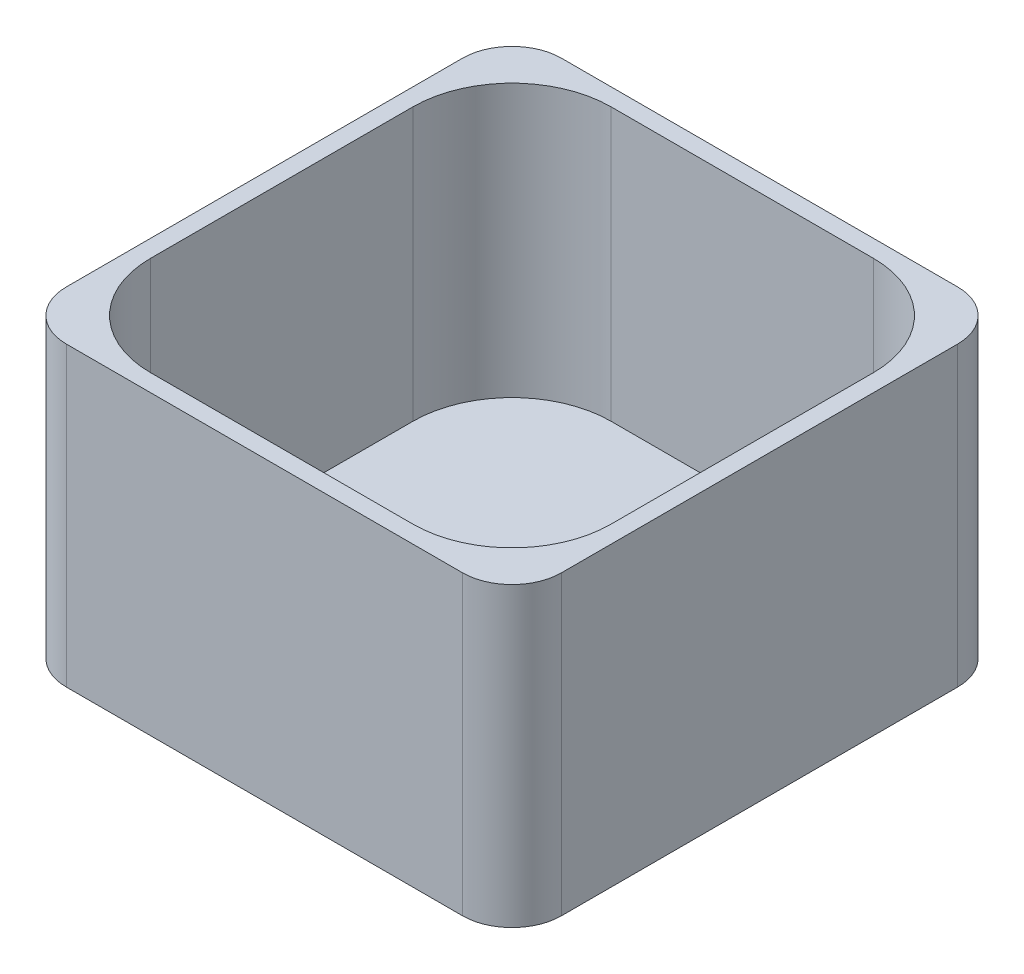
ISO-10303-21;
HEADER;
FILE_DESCRIPTION(('STEP AP214'),'2;1');
FILE_NAME('part.step','',(''),(''),'','','');
FILE_SCHEMA(('AUTOMOTIVE_DESIGN { 1 0 10303 214 1 1 1 1 }'));
ENDSEC;
DATA;
#1=APPLICATION_CONTEXT('core data for automotive mechanical design processes');
#2=APPLICATION_PROTOCOL_DEFINITION('international standard','automotive_design',2000,#1);
#3=PRODUCT_CONTEXT('',#1,'mechanical');
#4=PRODUCT('Part','Part','',(#3));
#5=PRODUCT_RELATED_PRODUCT_CATEGORY('part','',(#4));
#6=PRODUCT_DEFINITION_FORMATION('','',#4);
#7=PRODUCT_DEFINITION_CONTEXT('part definition',#1,'design');
#8=PRODUCT_DEFINITION('design','',#6,#7);
#9=PRODUCT_DEFINITION_SHAPE('','',#8);
#10=(LENGTH_UNIT() NAMED_UNIT(*) SI_UNIT(.MILLI.,.METRE.));
#11=(NAMED_UNIT(*) PLANE_ANGLE_UNIT() SI_UNIT($,.RADIAN.));
#12=(NAMED_UNIT(*) SI_UNIT($,.STERADIAN.) SOLID_ANGLE_UNIT());
#13=UNCERTAINTY_MEASURE_WITH_UNIT(LENGTH_MEASURE(1.E-05),#10,'distance_accuracy_value','');
#14=(GEOMETRIC_REPRESENTATION_CONTEXT(3) GLOBAL_UNCERTAINTY_ASSIGNED_CONTEXT((#13)) GLOBAL_UNIT_ASSIGNED_CONTEXT((#10,
#11,#12)) REPRESENTATION_CONTEXT('',''));
#15=CARTESIAN_POINT('',(0.,0.,0.));
#16=DIRECTION('',(0.,0.,1.));
#17=DIRECTION('',(1.,0.,0.));
#18=AXIS2_PLACEMENT_3D('',#15,#16,#17);
#19=CARTESIAN_POINT('',(50.,60.,50.));
#20=DIRECTION('',(-1.,0.,0.));
#21=DIRECTION('',(0.,0.,1.));
#22=AXIS2_PLACEMENT_3D('',#19,#20,#21);
#23=PLANE('',#22);
#24=DIRECTION('',(0.,0.,-1.));
#25=VECTOR('',#24,1.);
#26=CARTESIAN_POINT('',(50.,0.,50.));
#27=LINE('',#26,#25);
#28=CARTESIAN_POINT('',(50.,0.,40.));
#29=VERTEX_POINT('',#28);
#30=CARTESIAN_POINT('',(50.,0.,-40.));
#31=VERTEX_POINT('',#30);
#32=EDGE_CURVE('E208',#29,#31,#27,.T.);
#33=ORIENTED_EDGE('',*,*,#32,.T.);
#34=DIRECTION('',(0.,-1.,0.));
#35=VECTOR('',#34,1.);
#36=CARTESIAN_POINT('',(50.,60.,-40.));
#37=LINE('',#36,#35);
#38=CARTESIAN_POINT('',(50.,60.,-40.));
#39=VERTEX_POINT('',#38);
#40=EDGE_CURVE('E262',#31,#39,#37,.F.);
#41=ORIENTED_EDGE('',*,*,#40,.T.);
#42=DIRECTION('',(0.,0.,-1.));
#43=VECTOR('',#42,1.);
#44=CARTESIAN_POINT('',(50.,60.,50.));
#45=LINE('',#44,#43);
#46=CARTESIAN_POINT('',(50.,60.,40.));
#47=VERTEX_POINT('',#46);
#48=EDGE_CURVE('E197',#47,#39,#45,.T.);
#49=ORIENTED_EDGE('',*,*,#48,.F.);
#50=DIRECTION('',(0.,-1.,0.));
#51=VECTOR('',#50,1.);
#52=CARTESIAN_POINT('',(50.,60.,40.));
#53=LINE('',#52,#51);
#54=EDGE_CURVE('E261',#47,#29,#53,.T.);
#55=ORIENTED_EDGE('',*,*,#54,.T.);
#56=EDGE_LOOP('',(#33,#41,#49,#55));
#57=FACE_BOUND('',#56,.T.);
#58=ADVANCED_FACE('F44',(#57),#23,.F.);
#59=CARTESIAN_POINT('',(-50.,60.,-50.));
#60=DIRECTION('',(0.,0.,1.));
#61=DIRECTION('',(1.,0.,0.));
#62=AXIS2_PLACEMENT_3D('',#59,#60,#61);
#63=PLANE('',#62);
#64=DIRECTION('',(-1.,0.,0.));
#65=VECTOR('',#64,1.);
#66=CARTESIAN_POINT('',(-50.,60.,-50.));
#67=LINE('',#66,#65);
#68=CARTESIAN_POINT('',(40.,60.,-50.));
#69=VERTEX_POINT('',#68);
#70=CARTESIAN_POINT('',(-40.,60.,-50.));
#71=VERTEX_POINT('',#70);
#72=EDGE_CURVE('E199',#69,#71,#67,.T.);
#73=ORIENTED_EDGE('',*,*,#72,.F.);
#74=DIRECTION('',(0.,-1.,0.));
#75=VECTOR('',#74,1.);
#76=CARTESIAN_POINT('',(40.,60.,-50.));
#77=LINE('',#76,#75);
#78=CARTESIAN_POINT('',(40.,0.,-50.));
#79=VERTEX_POINT('',#78);
#80=EDGE_CURVE('E246',#69,#79,#77,.T.);
#81=ORIENTED_EDGE('',*,*,#80,.T.);
#82=DIRECTION('',(-1.,0.,0.));
#83=VECTOR('',#82,1.);
#84=CARTESIAN_POINT('',(-50.,0.,-50.));
#85=LINE('',#84,#83);
#86=CARTESIAN_POINT('',(-40.,0.,-50.));
#87=VERTEX_POINT('',#86);
#88=EDGE_CURVE('E211',#79,#87,#85,.T.);
#89=ORIENTED_EDGE('',*,*,#88,.T.);
#90=DIRECTION('',(0.,-1.,0.));
#91=VECTOR('',#90,1.);
#92=CARTESIAN_POINT('',(-40.,60.,-50.));
#93=LINE('',#92,#91);
#94=EDGE_CURVE('E248',#87,#71,#93,.F.);
#95=ORIENTED_EDGE('',*,*,#94,.T.);
#96=EDGE_LOOP('',(#73,#81,#89,#95));
#97=FACE_BOUND('',#96,.T.);
#98=ADVANCED_FACE('F308',(#97),#63,.F.);
#99=CARTESIAN_POINT('',(-50.,60.,50.));
#100=DIRECTION('',(1.,0.,0.));
#101=DIRECTION('',(0.,0.,-1.));
#102=AXIS2_PLACEMENT_3D('',#99,#100,#101);
#103=PLANE('',#102);
#104=DIRECTION('',(0.,0.,1.));
#105=VECTOR('',#104,1.);
#106=CARTESIAN_POINT('',(-50.,60.,50.));
#107=LINE('',#106,#105);
#108=CARTESIAN_POINT('',(-50.,60.,-40.));
#109=VERTEX_POINT('',#108);
#110=CARTESIAN_POINT('',(-50.,60.,40.));
#111=VERTEX_POINT('',#110);
#112=EDGE_CURVE('E204',#109,#111,#107,.T.);
#113=ORIENTED_EDGE('',*,*,#112,.F.);
#114=DIRECTION('',(0.,-1.,0.));
#115=VECTOR('',#114,1.);
#116=CARTESIAN_POINT('',(-50.,60.,-40.));
#117=LINE('',#116,#115);
#118=CARTESIAN_POINT('',(-50.,0.,-40.));
#119=VERTEX_POINT('',#118);
#120=EDGE_CURVE('E274',#109,#119,#117,.T.);
#121=ORIENTED_EDGE('',*,*,#120,.T.);
#122=DIRECTION('',(0.,0.,1.));
#123=VECTOR('',#122,1.);
#124=CARTESIAN_POINT('',(-50.,0.,50.));
#125=LINE('',#124,#123);
#126=CARTESIAN_POINT('',(-50.,0.,40.));
#127=VERTEX_POINT('',#126);
#128=EDGE_CURVE('E212',#119,#127,#125,.T.);
#129=ORIENTED_EDGE('',*,*,#128,.T.);
#130=DIRECTION('',(0.,-1.,0.));
#131=VECTOR('',#130,1.);
#132=CARTESIAN_POINT('',(-50.,60.,40.));
#133=LINE('',#132,#131);
#134=EDGE_CURVE('E272',#127,#111,#133,.F.);
#135=ORIENTED_EDGE('',*,*,#134,.T.);
#136=EDGE_LOOP('',(#113,#121,#129,#135));
#137=FACE_BOUND('',#136,.T.);
#138=ADVANCED_FACE('F283',(#137),#103,.F.);
#139=CARTESIAN_POINT('',(-50.,60.,50.));
#140=DIRECTION('',(0.,0.,-1.));
#141=DIRECTION('',(-1.,0.,0.));
#142=AXIS2_PLACEMENT_3D('',#139,#140,#141);
#143=PLANE('',#142);
#144=DIRECTION('',(1.,0.,0.));
#145=VECTOR('',#144,1.);
#146=CARTESIAN_POINT('',(-50.,60.,50.));
#147=LINE('',#146,#145);
#148=CARTESIAN_POINT('',(-40.,60.,50.));
#149=VERTEX_POINT('',#148);
#150=CARTESIAN_POINT('',(40.,60.,50.));
#151=VERTEX_POINT('',#150);
#152=EDGE_CURVE('E206',#149,#151,#147,.T.);
#153=ORIENTED_EDGE('',*,*,#152,.F.);
#154=DIRECTION('',(0.,-1.,0.));
#155=VECTOR('',#154,1.);
#156=CARTESIAN_POINT('',(-40.,60.,50.));
#157=LINE('',#156,#155);
#158=CARTESIAN_POINT('',(-40.,0.,50.));
#159=VERTEX_POINT('',#158);
#160=EDGE_CURVE('E11',#149,#159,#157,.T.);
#161=ORIENTED_EDGE('',*,*,#160,.T.);
#162=DIRECTION('',(1.,0.,0.));
#163=VECTOR('',#162,1.);
#164=CARTESIAN_POINT('',(-50.,0.,50.));
#165=LINE('',#164,#163);
#166=CARTESIAN_POINT('',(40.,0.,50.));
#167=VERTEX_POINT('',#166);
#168=EDGE_CURVE('E203',#159,#167,#165,.T.);
#169=ORIENTED_EDGE('',*,*,#168,.T.);
#170=DIRECTION('',(0.,-1.,0.));
#171=VECTOR('',#170,1.);
#172=CARTESIAN_POINT('',(40.,60.,50.));
#173=LINE('',#172,#171);
#174=EDGE_CURVE('E52',#167,#151,#173,.F.);
#175=ORIENTED_EDGE('',*,*,#174,.T.);
#176=EDGE_LOOP('',(#153,#161,#169,#175));
#177=FACE_BOUND('',#176,.T.);
#178=ADVANCED_FACE('F295',(#177),#143,.F.);
#179=CARTESIAN_POINT('',(0.,60.,0.));
#180=DIRECTION('',(0.,-1.,0.));
#181=DIRECTION('',(0.,0.,-1.));
#182=AXIS2_PLACEMENT_3D('',#179,#180,#181);
#183=PLANE('',#182);
#184=DIRECTION('',(-1.,0.,0.));
#185=VECTOR('',#184,1.);
#186=CARTESIAN_POINT('',(-46.5,60.,-46.5));
#187=LINE('',#186,#185);
#188=CARTESIAN_POINT('',(26.5,60.,-46.5));
#189=VERTEX_POINT('',#188);
#190=CARTESIAN_POINT('',(-26.5,60.,-46.5));
#191=VERTEX_POINT('',#190);
#192=EDGE_CURVE('E193',#189,#191,#187,.T.);
#193=ORIENTED_EDGE('',*,*,#192,.F.);
#194=CARTESIAN_POINT('',(26.5,60.,-26.5));
#195=DIRECTION('',(0.,-1.,0.));
#196=DIRECTION('',(0.,0.,-1.));
#197=AXIS2_PLACEMENT_3D('',#194,#195,#196);
#198=CIRCLE('',#197,20.);
#199=CARTESIAN_POINT('',(46.5,60.,-26.5));
#200=VERTEX_POINT('',#199);
#201=EDGE_CURVE('E241',#189,#200,#198,.T.);
#202=ORIENTED_EDGE('',*,*,#201,.T.);
#203=DIRECTION('',(0.,0.,-1.));
#204=VECTOR('',#203,1.);
#205=CARTESIAN_POINT('',(46.5,60.,46.5));
#206=LINE('',#205,#204);
#207=CARTESIAN_POINT('',(46.5,60.,26.5));
#208=VERTEX_POINT('',#207);
#209=EDGE_CURVE('E222',#208,#200,#206,.T.);
#210=ORIENTED_EDGE('',*,*,#209,.F.);
#211=CARTESIAN_POINT('',(26.5,60.,26.5));
#212=DIRECTION('',(0.,-1.,0.));
#213=DIRECTION('',(0.,0.,-1.));
#214=AXIS2_PLACEMENT_3D('',#211,#212,#213);
#215=CIRCLE('',#214,20.);
#216=CARTESIAN_POINT('',(26.5,60.,46.5));
#217=VERTEX_POINT('',#216);
#218=EDGE_CURVE('E188',#208,#217,#215,.T.);
#219=ORIENTED_EDGE('',*,*,#218,.T.);
#220=DIRECTION('',(1.,0.,0.));
#221=VECTOR('',#220,1.);
#222=CARTESIAN_POINT('',(-46.5,60.,46.5));
#223=LINE('',#222,#221);
#224=CARTESIAN_POINT('',(-26.5,60.,46.5));
#225=VERTEX_POINT('',#224);
#226=EDGE_CURVE('E177',#225,#217,#223,.T.);
#227=ORIENTED_EDGE('',*,*,#226,.F.);
#228=CARTESIAN_POINT('',(-26.5,60.,26.5));
#229=DIRECTION('',(0.,-1.,0.));
#230=DIRECTION('',(0.,0.,-1.));
#231=AXIS2_PLACEMENT_3D('',#228,#229,#230);
#232=CIRCLE('',#231,20.);
#233=CARTESIAN_POINT('',(-46.5,60.,26.5));
#234=VERTEX_POINT('',#233);
#235=EDGE_CURVE('E157',#225,#234,#232,.T.);
#236=ORIENTED_EDGE('',*,*,#235,.T.);
#237=DIRECTION('',(0.,0.,1.));
#238=VECTOR('',#237,1.);
#239=CARTESIAN_POINT('',(-46.5,60.,46.5));
#240=LINE('',#239,#238);
#241=CARTESIAN_POINT('',(-46.5,60.,-26.5));
#242=VERTEX_POINT('',#241);
#243=EDGE_CURVE('E187',#242,#234,#240,.T.);
#244=ORIENTED_EDGE('',*,*,#243,.F.);
#245=CARTESIAN_POINT('',(-26.5,60.,-26.5));
#246=DIRECTION('',(0.,-1.,0.));
#247=DIRECTION('',(0.,0.,-1.));
#248=AXIS2_PLACEMENT_3D('',#245,#246,#247);
#249=CIRCLE('',#248,20.);
#250=EDGE_CURVE('E166',#242,#191,#249,.T.);
#251=ORIENTED_EDGE('',*,*,#250,.T.);
#252=EDGE_LOOP('',(#193,#202,#210,#219,#227,#236,#244,#251));
#253=FACE_BOUND('',#252,.T.);
#254=ORIENTED_EDGE('',*,*,#48,.T.);
#255=CARTESIAN_POINT('',(40.,60.,-40.));
#256=DIRECTION('',(0.,-1.,0.));
#257=DIRECTION('',(0.,0.,-1.));
#258=AXIS2_PLACEMENT_3D('',#255,#256,#257);
#259=CIRCLE('',#258,10.);
#260=EDGE_CURVE('E271',#39,#69,#259,.F.);
#261=ORIENTED_EDGE('',*,*,#260,.T.);
#262=ORIENTED_EDGE('',*,*,#72,.T.);
#263=CARTESIAN_POINT('',(-40.,60.,-40.));
#264=DIRECTION('',(0.,-1.,0.));
#265=DIRECTION('',(0.,0.,-1.));
#266=AXIS2_PLACEMENT_3D('',#263,#264,#265);
#267=CIRCLE('',#266,10.);
#268=EDGE_CURVE('E267',#71,#109,#267,.F.);
#269=ORIENTED_EDGE('',*,*,#268,.T.);
#270=ORIENTED_EDGE('',*,*,#112,.T.);
#271=CARTESIAN_POINT('',(-40.,60.,40.));
#272=DIRECTION('',(0.,-1.,0.));
#273=DIRECTION('',(0.,0.,-1.));
#274=AXIS2_PLACEMENT_3D('',#271,#272,#273);
#275=CIRCLE('',#274,10.);
#276=EDGE_CURVE('E67',#111,#149,#275,.F.);
#277=ORIENTED_EDGE('',*,*,#276,.T.);
#278=ORIENTED_EDGE('',*,*,#152,.T.);
#279=CARTESIAN_POINT('',(40.,60.,40.));
#280=DIRECTION('',(0.,-1.,0.));
#281=DIRECTION('',(0.,0.,-1.));
#282=AXIS2_PLACEMENT_3D('',#279,#280,#281);
#283=CIRCLE('',#282,10.);
#284=EDGE_CURVE('E266',#151,#47,#283,.F.);
#285=ORIENTED_EDGE('',*,*,#284,.T.);
#286=EDGE_LOOP('',(#254,#261,#262,#269,#270,#277,#278,#285));
#287=FACE_BOUND('',#286,.T.);
#288=ADVANCED_FACE('F184',(#253,#287),#183,.F.);
#289=CARTESIAN_POINT('',(0.,0.,0.));
#290=DIRECTION('',(0.,-1.,0.));
#291=DIRECTION('',(0.,0.,-1.));
#292=AXIS2_PLACEMENT_3D('',#289,#290,#291);
#293=PLANE('',#292);
#294=CARTESIAN_POINT('',(0.,0.,0.));
#295=DIRECTION('',(0.,-1.,0.));
#296=DIRECTION('',(0.,0.,-1.));
#297=AXIS2_PLACEMENT_3D('',#294,#295,#296);
#298=CIRCLE('',#297,20.);
#299=CARTESIAN_POINT('',(0.,0.,-20.));
#300=VERTEX_POINT('',#299);
#301=EDGE_CURVE('E217',#300,#300,#298,.T.);
#302=ORIENTED_EDGE('',*,*,#301,.F.);
#303=EDGE_LOOP('',(#302));
#304=FACE_BOUND('',#303,.T.);
#305=ORIENTED_EDGE('',*,*,#88,.F.);
#306=CARTESIAN_POINT('',(40.,0.,-40.));
#307=DIRECTION('',(0.,-1.,0.));
#308=DIRECTION('',(0.,0.,-1.));
#309=AXIS2_PLACEMENT_3D('',#306,#307,#308);
#310=CIRCLE('',#309,10.);
#311=EDGE_CURVE('E259',#79,#31,#310,.T.);
#312=ORIENTED_EDGE('',*,*,#311,.T.);
#313=ORIENTED_EDGE('',*,*,#32,.F.);
#314=CARTESIAN_POINT('',(40.,0.,40.));
#315=DIRECTION('',(0.,-1.,0.));
#316=DIRECTION('',(0.,0.,-1.));
#317=AXIS2_PLACEMENT_3D('',#314,#315,#316);
#318=CIRCLE('',#317,10.);
#319=EDGE_CURVE('E251',#29,#167,#318,.T.);
#320=ORIENTED_EDGE('',*,*,#319,.T.);
#321=ORIENTED_EDGE('',*,*,#168,.F.);
#322=CARTESIAN_POINT('',(-40.,0.,40.));
#323=DIRECTION('',(0.,-1.,0.));
#324=DIRECTION('',(0.,0.,-1.));
#325=AXIS2_PLACEMENT_3D('',#322,#323,#324);
#326=CIRCLE('',#325,10.);
#327=EDGE_CURVE('E254',#159,#127,#326,.T.);
#328=ORIENTED_EDGE('',*,*,#327,.T.);
#329=ORIENTED_EDGE('',*,*,#128,.F.);
#330=CARTESIAN_POINT('',(-40.,0.,-40.));
#331=DIRECTION('',(0.,-1.,0.));
#332=DIRECTION('',(0.,0.,-1.));
#333=AXIS2_PLACEMENT_3D('',#330,#331,#332);
#334=CIRCLE('',#333,10.);
#335=EDGE_CURVE('E260',#119,#87,#334,.T.);
#336=ORIENTED_EDGE('',*,*,#335,.T.);
#337=EDGE_LOOP('',(#305,#312,#313,#320,#321,#328,#329,#336));
#338=FACE_BOUND('',#337,.T.);
#339=ADVANCED_FACE('F290',(#304,#338),#293,.T.);
#340=CARTESIAN_POINT('',(46.5,5.,46.5));
#341=DIRECTION('',(1.,0.,0.));
#342=DIRECTION('',(0.,0.,-1.));
#343=AXIS2_PLACEMENT_3D('',#340,#341,#342);
#344=PLANE('',#343);
#345=ORIENTED_EDGE('',*,*,#209,.T.);
#346=DIRECTION('',(0.,1.,0.));
#347=VECTOR('',#346,1.);
#348=CARTESIAN_POINT('',(46.5,5.,-26.5));
#349=LINE('',#348,#347);
#350=CARTESIAN_POINT('',(46.5,5.,-26.5));
#351=VERTEX_POINT('',#350);
#352=EDGE_CURVE('E168',#200,#351,#349,.F.);
#353=ORIENTED_EDGE('',*,*,#352,.T.);
#354=DIRECTION('',(0.,0.,-1.));
#355=VECTOR('',#354,1.);
#356=CARTESIAN_POINT('',(46.5,5.,46.5));
#357=LINE('',#356,#355);
#358=CARTESIAN_POINT('',(46.5,5.,26.5));
#359=VERTEX_POINT('',#358);
#360=EDGE_CURVE('E189',#359,#351,#357,.T.);
#361=ORIENTED_EDGE('',*,*,#360,.F.);
#362=DIRECTION('',(0.,1.,0.));
#363=VECTOR('',#362,1.);
#364=CARTESIAN_POINT('',(46.5,60.,26.5));
#365=LINE('',#364,#363);
#366=EDGE_CURVE('E238',#359,#208,#365,.T.);
#367=ORIENTED_EDGE('',*,*,#366,.T.);
#368=EDGE_LOOP('',(#345,#353,#361,#367));
#369=FACE_BOUND('',#368,.T.);
#370=ADVANCED_FACE('F349',(#369),#344,.F.);
#371=CARTESIAN_POINT('',(-46.5,5.,46.5));
#372=DIRECTION('',(0.,0.,1.));
#373=DIRECTION('',(1.,0.,0.));
#374=AXIS2_PLACEMENT_3D('',#371,#372,#373);
#375=PLANE('',#374);
#376=DIRECTION('',(1.,0.,0.));
#377=VECTOR('',#376,1.);
#378=CARTESIAN_POINT('',(-46.5,5.,46.5));
#379=LINE('',#378,#377);
#380=CARTESIAN_POINT('',(-26.5,5.,46.5));
#381=VERTEX_POINT('',#380);
#382=CARTESIAN_POINT('',(26.5,5.,46.5));
#383=VERTEX_POINT('',#382);
#384=EDGE_CURVE('E179',#381,#383,#379,.T.);
#385=ORIENTED_EDGE('',*,*,#384,.F.);
#386=DIRECTION('',(0.,1.,0.));
#387=VECTOR('',#386,1.);
#388=CARTESIAN_POINT('',(-26.5,60.,46.5));
#389=LINE('',#388,#387);
#390=EDGE_CURVE('E162',#381,#225,#389,.T.);
#391=ORIENTED_EDGE('',*,*,#390,.T.);
#392=ORIENTED_EDGE('',*,*,#226,.T.);
#393=DIRECTION('',(0.,1.,0.));
#394=VECTOR('',#393,1.);
#395=CARTESIAN_POINT('',(26.5,5.,46.5));
#396=LINE('',#395,#394);
#397=EDGE_CURVE('E182',#217,#383,#396,.F.);
#398=ORIENTED_EDGE('',*,*,#397,.T.);
#399=EDGE_LOOP('',(#385,#391,#392,#398));
#400=FACE_BOUND('',#399,.T.);
#401=ADVANCED_FACE('F171',(#400),#375,.F.);
#402=CARTESIAN_POINT('',(-46.5,5.,46.5));
#403=DIRECTION('',(-1.,0.,0.));
#404=DIRECTION('',(0.,0.,1.));
#405=AXIS2_PLACEMENT_3D('',#402,#403,#404);
#406=PLANE('',#405);
#407=ORIENTED_EDGE('',*,*,#243,.T.);
#408=DIRECTION('',(0.,1.,0.));
#409=VECTOR('',#408,1.);
#410=CARTESIAN_POINT('',(-46.5,5.,26.5));
#411=LINE('',#410,#409);
#412=CARTESIAN_POINT('',(-46.5,5.,26.5));
#413=VERTEX_POINT('',#412);
#414=EDGE_CURVE('E163',#234,#413,#411,.F.);
#415=ORIENTED_EDGE('',*,*,#414,.T.);
#416=DIRECTION('',(0.,0.,1.));
#417=VECTOR('',#416,1.);
#418=CARTESIAN_POINT('',(-46.5,5.,46.5));
#419=LINE('',#418,#417);
#420=CARTESIAN_POINT('',(-46.5,5.,-26.5));
#421=VERTEX_POINT('',#420);
#422=EDGE_CURVE('E359',#421,#413,#419,.T.);
#423=ORIENTED_EDGE('',*,*,#422,.F.);
#424=DIRECTION('',(0.,1.,0.));
#425=VECTOR('',#424,1.);
#426=CARTESIAN_POINT('',(-46.5,60.,-26.5));
#427=LINE('',#426,#425);
#428=EDGE_CURVE('E176',#421,#242,#427,.T.);
#429=ORIENTED_EDGE('',*,*,#428,.T.);
#430=EDGE_LOOP('',(#407,#415,#423,#429));
#431=FACE_BOUND('',#430,.T.);
#432=ADVANCED_FACE('F366',(#431),#406,.F.);
#433=CARTESIAN_POINT('',(-46.5,5.,-46.5));
#434=DIRECTION('',(0.,0.,-1.));
#435=DIRECTION('',(-1.,0.,0.));
#436=AXIS2_PLACEMENT_3D('',#433,#434,#435);
#437=PLANE('',#436);
#438=ORIENTED_EDGE('',*,*,#192,.T.);
#439=DIRECTION('',(0.,1.,0.));
#440=VECTOR('',#439,1.);
#441=CARTESIAN_POINT('',(-26.5,5.,-46.5));
#442=LINE('',#441,#440);
#443=CARTESIAN_POINT('',(-26.5,5.,-46.5));
#444=VERTEX_POINT('',#443);
#445=EDGE_CURVE('E236',#191,#444,#442,.F.);
#446=ORIENTED_EDGE('',*,*,#445,.T.);
#447=DIRECTION('',(-1.,0.,0.));
#448=VECTOR('',#447,1.);
#449=CARTESIAN_POINT('',(-46.5,5.,-46.5));
#450=LINE('',#449,#448);
#451=CARTESIAN_POINT('',(26.5,5.,-46.5));
#452=VERTEX_POINT('',#451);
#453=EDGE_CURVE('E192',#452,#444,#450,.T.);
#454=ORIENTED_EDGE('',*,*,#453,.F.);
#455=DIRECTION('',(0.,1.,0.));
#456=VECTOR('',#455,1.);
#457=CARTESIAN_POINT('',(26.5,60.,-46.5));
#458=LINE('',#457,#456);
#459=EDGE_CURVE('E231',#452,#189,#458,.T.);
#460=ORIENTED_EDGE('',*,*,#459,.T.);
#461=EDGE_LOOP('',(#438,#446,#454,#460));
#462=FACE_BOUND('',#461,.T.);
#463=ADVANCED_FACE('F360',(#462),#437,.F.);
#464=CARTESIAN_POINT('',(0.,5.,0.));
#465=DIRECTION('',(0.,-1.,0.));
#466=DIRECTION('',(0.,0.,-1.));
#467=AXIS2_PLACEMENT_3D('',#464,#465,#466);
#468=PLANE('',#467);
#469=CARTESIAN_POINT('',(0.,5.,0.));
#470=DIRECTION('',(0.,1.,0.));
#471=DIRECTION('',(0.,0.,1.));
#472=AXIS2_PLACEMENT_3D('',#469,#470,#471);
#473=CIRCLE('',#472,20.);
#474=CARTESIAN_POINT('',(0.,5.,20.));
#475=VERTEX_POINT('',#474);
#476=EDGE_CURVE('E225',#475,#475,#473,.T.);
#477=ORIENTED_EDGE('',*,*,#476,.F.);
#478=EDGE_LOOP('',(#477));
#479=FACE_BOUND('',#478,.T.);
#480=ORIENTED_EDGE('',*,*,#422,.T.);
#481=CARTESIAN_POINT('',(-26.5,5.,26.5));
#482=DIRECTION('',(0.,-1.,0.));
#483=DIRECTION('',(0.,0.,-1.));
#484=AXIS2_PLACEMENT_3D('',#481,#482,#483);
#485=CIRCLE('',#484,20.);
#486=EDGE_CURVE('E233',#413,#381,#485,.F.);
#487=ORIENTED_EDGE('',*,*,#486,.T.);
#488=ORIENTED_EDGE('',*,*,#384,.T.);
#489=CARTESIAN_POINT('',(26.5,5.,26.5));
#490=DIRECTION('',(0.,-1.,0.));
#491=DIRECTION('',(0.,0.,-1.));
#492=AXIS2_PLACEMENT_3D('',#489,#490,#491);
#493=CIRCLE('',#492,20.);
#494=EDGE_CURVE('E229',#383,#359,#493,.F.);
#495=ORIENTED_EDGE('',*,*,#494,.T.);
#496=ORIENTED_EDGE('',*,*,#360,.T.);
#497=CARTESIAN_POINT('',(26.5,5.,-26.5));
#498=DIRECTION('',(0.,-1.,0.));
#499=DIRECTION('',(0.,0.,-1.));
#500=AXIS2_PLACEMENT_3D('',#497,#498,#499);
#501=CIRCLE('',#500,20.);
#502=EDGE_CURVE('E230',#351,#452,#501,.F.);
#503=ORIENTED_EDGE('',*,*,#502,.T.);
#504=ORIENTED_EDGE('',*,*,#453,.T.);
#505=CARTESIAN_POINT('',(-26.5,5.,-26.5));
#506=DIRECTION('',(0.,-1.,0.));
#507=DIRECTION('',(0.,0.,-1.));
#508=AXIS2_PLACEMENT_3D('',#505,#506,#507);
#509=CIRCLE('',#508,20.);
#510=EDGE_CURVE('E232',#444,#421,#509,.F.);
#511=ORIENTED_EDGE('',*,*,#510,.T.);
#512=EDGE_LOOP('',(#480,#487,#488,#495,#496,#503,#504,#511));
#513=FACE_BOUND('',#512,.T.);
#514=ADVANCED_FACE('F341',(#479,#513),#468,.F.);
#515=CARTESIAN_POINT('',(0.,-61.,0.));
#516=DIRECTION('',(0.,1.,0.));
#517=DIRECTION('',(0.,0.,1.));
#518=AXIS2_PLACEMENT_3D('',#515,#516,#517);
#519=CYLINDRICAL_SURFACE('',#518,20.);
#520=ORIENTED_EDGE('',*,*,#301,.T.);
#521=EDGE_LOOP('',(#520));
#522=FACE_BOUND('',#521,.T.);
#523=ORIENTED_EDGE('',*,*,#476,.T.);
#524=EDGE_LOOP('',(#523));
#525=FACE_BOUND('',#524,.T.);
#526=ADVANCED_FACE('F328',(#522,#525),#519,.F.);
#527=CARTESIAN_POINT('',(-26.5,5.,26.5));
#528=DIRECTION('',(0.,-1.,0.));
#529=DIRECTION('',(0.,0.,-1.));
#530=AXIS2_PLACEMENT_3D('',#527,#528,#529);
#531=CYLINDRICAL_SURFACE('',#530,20.);
#532=ORIENTED_EDGE('',*,*,#486,.F.);
#533=ORIENTED_EDGE('',*,*,#414,.F.);
#534=ORIENTED_EDGE('',*,*,#235,.F.);
#535=ORIENTED_EDGE('',*,*,#390,.F.);
#536=EDGE_LOOP('',(#532,#533,#534,#535));
#537=FACE_BOUND('',#536,.T.);
#538=ADVANCED_FACE('F165',(#537),#531,.F.);
#539=CARTESIAN_POINT('',(-26.5,5.,-26.5));
#540=DIRECTION('',(0.,-1.,0.));
#541=DIRECTION('',(0.,0.,-1.));
#542=AXIS2_PLACEMENT_3D('',#539,#540,#541);
#543=CYLINDRICAL_SURFACE('',#542,20.);
#544=ORIENTED_EDGE('',*,*,#510,.F.);
#545=ORIENTED_EDGE('',*,*,#445,.F.);
#546=ORIENTED_EDGE('',*,*,#250,.F.);
#547=ORIENTED_EDGE('',*,*,#428,.F.);
#548=EDGE_LOOP('',(#544,#545,#546,#547));
#549=FACE_BOUND('',#548,.T.);
#550=ADVANCED_FACE('F327',(#549),#543,.F.);
#551=CARTESIAN_POINT('',(26.5,5.,-26.5));
#552=DIRECTION('',(0.,-1.,0.));
#553=DIRECTION('',(0.,0.,-1.));
#554=AXIS2_PLACEMENT_3D('',#551,#552,#553);
#555=CYLINDRICAL_SURFACE('',#554,20.);
#556=ORIENTED_EDGE('',*,*,#502,.F.);
#557=ORIENTED_EDGE('',*,*,#352,.F.);
#558=ORIENTED_EDGE('',*,*,#201,.F.);
#559=ORIENTED_EDGE('',*,*,#459,.F.);
#560=EDGE_LOOP('',(#556,#557,#558,#559));
#561=FACE_BOUND('',#560,.T.);
#562=ADVANCED_FACE('F335',(#561),#555,.F.);
#563=CARTESIAN_POINT('',(26.5,5.,26.5));
#564=DIRECTION('',(0.,-1.,0.));
#565=DIRECTION('',(0.,0.,-1.));
#566=AXIS2_PLACEMENT_3D('',#563,#564,#565);
#567=CYLINDRICAL_SURFACE('',#566,20.);
#568=ORIENTED_EDGE('',*,*,#494,.F.);
#569=ORIENTED_EDGE('',*,*,#397,.F.);
#570=ORIENTED_EDGE('',*,*,#218,.F.);
#571=ORIENTED_EDGE('',*,*,#366,.F.);
#572=EDGE_LOOP('',(#568,#569,#570,#571));
#573=FACE_BOUND('',#572,.T.);
#574=ADVANCED_FACE('F312',(#573),#567,.F.);
#575=CARTESIAN_POINT('',(40.,60.,-40.));
#576=DIRECTION('',(0.,-1.,0.));
#577=DIRECTION('',(0.,0.,-1.));
#578=AXIS2_PLACEMENT_3D('',#575,#576,#577);
#579=CYLINDRICAL_SURFACE('',#578,10.);
#580=ORIENTED_EDGE('',*,*,#260,.F.);
#581=ORIENTED_EDGE('',*,*,#40,.F.);
#582=ORIENTED_EDGE('',*,*,#311,.F.);
#583=ORIENTED_EDGE('',*,*,#80,.F.);
#584=EDGE_LOOP('',(#580,#581,#582,#583));
#585=FACE_BOUND('',#584,.T.);
#586=ADVANCED_FACE('F303',(#585),#579,.T.);
#587=CARTESIAN_POINT('',(-40.,60.,-40.));
#588=DIRECTION('',(0.,-1.,0.));
#589=DIRECTION('',(0.,0.,-1.));
#590=AXIS2_PLACEMENT_3D('',#587,#588,#589);
#591=CYLINDRICAL_SURFACE('',#590,10.);
#592=ORIENTED_EDGE('',*,*,#268,.F.);
#593=ORIENTED_EDGE('',*,*,#94,.F.);
#594=ORIENTED_EDGE('',*,*,#335,.F.);
#595=ORIENTED_EDGE('',*,*,#120,.F.);
#596=EDGE_LOOP('',(#592,#593,#594,#595));
#597=FACE_BOUND('',#596,.T.);
#598=ADVANCED_FACE('F306',(#597),#591,.T.);
#599=CARTESIAN_POINT('',(-40.,60.,40.));
#600=DIRECTION('',(0.,-1.,0.));
#601=DIRECTION('',(0.,0.,-1.));
#602=AXIS2_PLACEMENT_3D('',#599,#600,#601);
#603=CYLINDRICAL_SURFACE('',#602,10.);
#604=ORIENTED_EDGE('',*,*,#276,.F.);
#605=ORIENTED_EDGE('',*,*,#134,.F.);
#606=ORIENTED_EDGE('',*,*,#327,.F.);
#607=ORIENTED_EDGE('',*,*,#160,.F.);
#608=EDGE_LOOP('',(#604,#605,#606,#607));
#609=FACE_BOUND('',#608,.T.);
#610=ADVANCED_FACE('F292',(#609),#603,.T.);
#611=CARTESIAN_POINT('',(40.,60.,40.));
#612=DIRECTION('',(0.,-1.,0.));
#613=DIRECTION('',(0.,0.,-1.));
#614=AXIS2_PLACEMENT_3D('',#611,#612,#613);
#615=CYLINDRICAL_SURFACE('',#614,10.);
#616=ORIENTED_EDGE('',*,*,#284,.F.);
#617=ORIENTED_EDGE('',*,*,#174,.F.);
#618=ORIENTED_EDGE('',*,*,#319,.F.);
#619=ORIENTED_EDGE('',*,*,#54,.F.);
#620=EDGE_LOOP('',(#616,#617,#618,#619));
#621=FACE_BOUND('',#620,.T.);
#622=ADVANCED_FACE('F50',(#621),#615,.T.);
#623=CLOSED_SHELL('',(#58,#98,#138,#178,#288,#339,#370,#401,#432,#463,#514,#526,#538,#550,#562,
#574,#586,#598,#610,#622));
#624=MANIFOLD_SOLID_BREP('B2',#623);
#625=ADVANCED_BREP_SHAPE_REPRESENTATION('',(#18,#624),#14);
#626=SHAPE_DEFINITION_REPRESENTATION(#9,#625);
ENDSEC;
END-ISO-10303-21;
